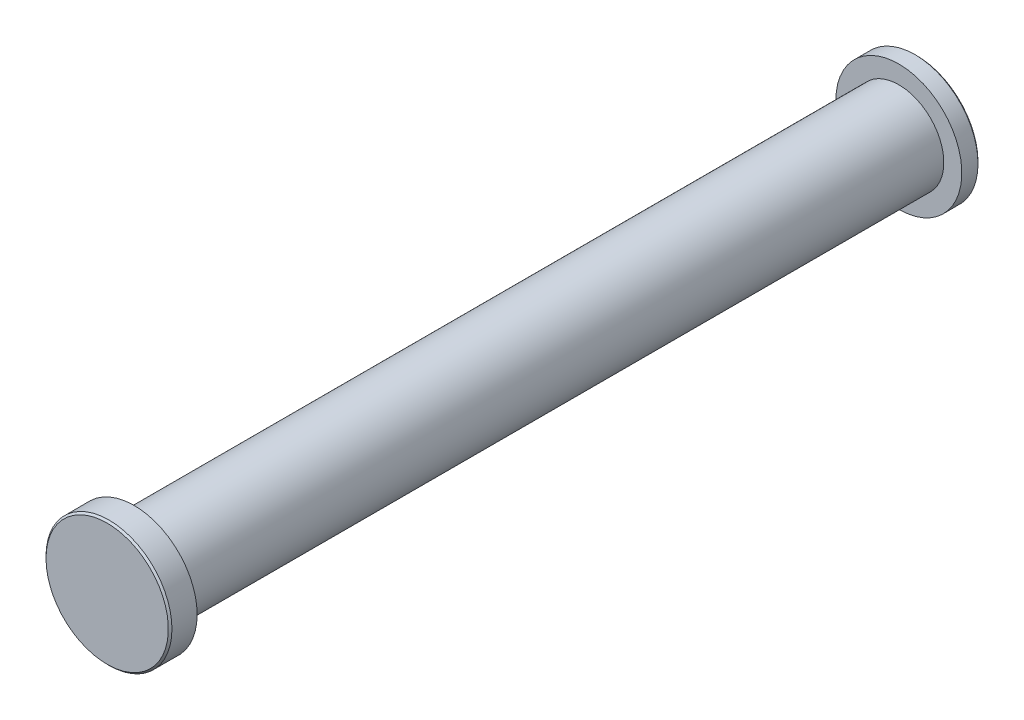
ISO-10303-21;
HEADER;
FILE_DESCRIPTION(('STEP AP214'),'2;1');
FILE_NAME('part.step','',(''),(''),'','','');
FILE_SCHEMA(('AUTOMOTIVE_DESIGN { 1 0 10303 214 1 1 1 1 }'));
ENDSEC;
DATA;
#1=APPLICATION_CONTEXT('core data for automotive mechanical design processes');
#2=APPLICATION_PROTOCOL_DEFINITION('international standard','automotive_design',2000,#1);
#3=PRODUCT_CONTEXT('',#1,'mechanical');
#4=PRODUCT('Part','Part','',(#3));
#5=PRODUCT_RELATED_PRODUCT_CATEGORY('part','',(#4));
#6=PRODUCT_DEFINITION_FORMATION('','',#4);
#7=PRODUCT_DEFINITION_CONTEXT('part definition',#1,'design');
#8=PRODUCT_DEFINITION('design','',#6,#7);
#9=PRODUCT_DEFINITION_SHAPE('','',#8);
#10=(LENGTH_UNIT() NAMED_UNIT(*) SI_UNIT(.MILLI.,.METRE.));
#11=(NAMED_UNIT(*) PLANE_ANGLE_UNIT() SI_UNIT($,.RADIAN.));
#12=(NAMED_UNIT(*) SI_UNIT($,.STERADIAN.) SOLID_ANGLE_UNIT());
#13=UNCERTAINTY_MEASURE_WITH_UNIT(LENGTH_MEASURE(1.E-05),#10,'distance_accuracy_value','');
#14=(GEOMETRIC_REPRESENTATION_CONTEXT(3) GLOBAL_UNCERTAINTY_ASSIGNED_CONTEXT((#13)) GLOBAL_UNIT_ASSIGNED_CONTEXT((#10,
#11,#12)) REPRESENTATION_CONTEXT('',''));
#15=CARTESIAN_POINT('',(0.,0.,0.));
#16=DIRECTION('',(0.,0.,1.));
#17=DIRECTION('',(1.,0.,0.));
#18=AXIS2_PLACEMENT_3D('',#15,#16,#17);
#19=CARTESIAN_POINT('',(-6.8816,-6.8816,0.));
#20=DIRECTION('',(0.,0.,1.));
#21=DIRECTION('',(1.,0.,0.));
#22=AXIS2_PLACEMENT_3D('',#19,#20,#21);
#23=PLANE('',#22);
#24=CARTESIAN_POINT('',(0.,0.,0.));
#25=DIRECTION('',(0.,0.,1.));
#26=DIRECTION('',(1.,0.,0.));
#27=AXIS2_PLACEMENT_3D('',#24,#25,#26);
#28=CIRCLE('',#27,6.8);
#29=CARTESIAN_POINT('',(6.8,0.,0.));
#30=VERTEX_POINT('',#29);
#31=EDGE_CURVE('E18',#30,#30,#28,.F.);
#32=ORIENTED_EDGE('',*,*,#31,.T.);
#33=EDGE_LOOP('',(#32));
#34=FACE_BOUND('',#33,.T.);
#35=ADVANCED_FACE('F14',(#34),#23,.F.);
#36=CARTESIAN_POINT('',(0.,0.,0.));
#37=DIRECTION('',(0.,0.,1.));
#38=DIRECTION('',(1.,0.,0.));
#39=AXIS2_PLACEMENT_3D('',#36,#37,#38);
#40=CONICAL_SURFACE('',#39,6.8,0.78539816339745);
#41=CARTESIAN_POINT('',(0.,0.,0.2));
#42=DIRECTION('',(0.,0.,-1.));
#43=DIRECTION('',(-1.,0.,0.));
#44=AXIS2_PLACEMENT_3D('',#41,#42,#43);
#45=CIRCLE('',#44,7.);
#46=CARTESIAN_POINT('',(-7.,0.,0.2));
#47=VERTEX_POINT('',#46);
#48=EDGE_CURVE('E31',#47,#47,#45,.T.);
#49=ORIENTED_EDGE('',*,*,#48,.T.);
#50=EDGE_LOOP('',(#49));
#51=FACE_BOUND('',#50,.T.);
#52=ORIENTED_EDGE('',*,*,#31,.F.);
#53=EDGE_LOOP('',(#52));
#54=FACE_BOUND('',#53,.T.);
#55=ADVANCED_FACE('F50',(#51,#54),#40,.T.);
#56=CARTESIAN_POINT('',(0.,0.,2.));
#57=DIRECTION('',(0.,0.,-1.));
#58=DIRECTION('',(-1.,0.,0.));
#59=AXIS2_PLACEMENT_3D('',#56,#57,#58);
#60=CYLINDRICAL_SURFACE('',#59,7.);
#61=ORIENTED_EDGE('',*,*,#48,.F.);
#62=EDGE_LOOP('',(#61));
#63=FACE_BOUND('',#62,.T.);
#64=CARTESIAN_POINT('',(0.,0.,2.));
#65=DIRECTION('',(0.,0.,-1.));
#66=DIRECTION('',(-1.,0.,0.));
#67=AXIS2_PLACEMENT_3D('',#64,#65,#66);
#68=CIRCLE('',#67,7.);
#69=CARTESIAN_POINT('',(-7.,0.,2.));
#70=VERTEX_POINT('',#69);
#71=EDGE_CURVE('E39',#70,#70,#68,.T.);
#72=ORIENTED_EDGE('',*,*,#71,.T.);
#73=EDGE_LOOP('',(#72));
#74=FACE_BOUND('',#73,.T.);
#75=ADVANCED_FACE('F52',(#63,#74),#60,.T.);
#76=CARTESIAN_POINT('',(7.084,-7.084,2.));
#77=DIRECTION('',(0.,0.,-1.));
#78=DIRECTION('',(-1.,0.,0.));
#79=AXIS2_PLACEMENT_3D('',#76,#77,#78);
#80=PLANE('',#79);
#81=CARTESIAN_POINT('',(0.,0.,2.));
#82=DIRECTION('',(0.,0.,-1.));
#83=DIRECTION('',(-1.,0.,0.));
#84=AXIS2_PLACEMENT_3D('',#81,#82,#83);
#85=CIRCLE('',#84,5.);
#86=CARTESIAN_POINT('',(-5.,0.,2.));
#87=VERTEX_POINT('',#86);
#88=EDGE_CURVE('E37',#87,#87,#85,.T.);
#89=ORIENTED_EDGE('',*,*,#88,.T.);
#90=EDGE_LOOP('',(#89));
#91=FACE_BOUND('',#90,.T.);
#92=ORIENTED_EDGE('',*,*,#71,.F.);
#93=EDGE_LOOP('',(#92));
#94=FACE_BOUND('',#93,.T.);
#95=ADVANCED_FACE('F59',(#91,#94),#80,.F.);
#96=CARTESIAN_POINT('',(0.,0.,87.));
#97=DIRECTION('',(0.,0.,-1.));
#98=DIRECTION('',(-1.,0.,0.));
#99=AXIS2_PLACEMENT_3D('',#96,#97,#98);
#100=CYLINDRICAL_SURFACE('',#99,5.);
#101=CARTESIAN_POINT('',(0.,0.,87.));
#102=DIRECTION('',(0.,0.,-1.));
#103=DIRECTION('',(-1.,0.,0.));
#104=AXIS2_PLACEMENT_3D('',#101,#102,#103);
#105=CIRCLE('',#104,5.);
#106=CARTESIAN_POINT('',(-5.,0.,87.));
#107=VERTEX_POINT('',#106);
#108=EDGE_CURVE('E34',#107,#107,#105,.T.);
#109=ORIENTED_EDGE('',*,*,#108,.T.);
#110=EDGE_LOOP('',(#109));
#111=FACE_BOUND('',#110,.T.);
#112=ORIENTED_EDGE('',*,*,#88,.F.);
#113=EDGE_LOOP('',(#112));
#114=FACE_BOUND('',#113,.T.);
#115=ADVANCED_FACE('F77',(#111,#114),#100,.T.);
#116=CARTESIAN_POINT('',(-7.084,-7.084,87.));
#117=DIRECTION('',(0.,0.,1.));
#118=DIRECTION('',(1.,0.,0.));
#119=AXIS2_PLACEMENT_3D('',#116,#117,#118);
#120=PLANE('',#119);
#121=ORIENTED_EDGE('',*,*,#108,.F.);
#122=EDGE_LOOP('',(#121));
#123=FACE_BOUND('',#122,.T.);
#124=CARTESIAN_POINT('',(0.,0.,87.));
#125=DIRECTION('',(0.,0.,1.));
#126=DIRECTION('',(1.,0.,0.));
#127=AXIS2_PLACEMENT_3D('',#124,#125,#126);
#128=CIRCLE('',#127,7.);
#129=CARTESIAN_POINT('',(7.,0.,87.));
#130=VERTEX_POINT('',#129);
#131=EDGE_CURVE('E27',#130,#130,#128,.F.);
#132=ORIENTED_EDGE('',*,*,#131,.T.);
#133=EDGE_LOOP('',(#132));
#134=FACE_BOUND('',#133,.T.);
#135=ADVANCED_FACE('F75',(#123,#134),#120,.F.);
#136=CARTESIAN_POINT('',(0.,0.,87.));
#137=DIRECTION('',(0.,0.,1.));
#138=DIRECTION('',(1.,0.,0.));
#139=AXIS2_PLACEMENT_3D('',#136,#137,#138);
#140=CYLINDRICAL_SURFACE('',#139,7.);
#141=CARTESIAN_POINT('',(0.,0.,89.8000000000001));
#142=DIRECTION('',(0.,0.,-1.));
#143=DIRECTION('',(-1.,0.,0.));
#144=AXIS2_PLACEMENT_3D('',#141,#142,#143);
#145=CIRCLE('',#144,7.);
#146=CARTESIAN_POINT('',(-7.,0.,89.8));
#147=VERTEX_POINT('',#146);
#148=EDGE_CURVE('E22',#147,#147,#145,.T.);
#149=ORIENTED_EDGE('',*,*,#148,.T.);
#150=EDGE_LOOP('',(#149));
#151=FACE_BOUND('',#150,.T.);
#152=ORIENTED_EDGE('',*,*,#131,.F.);
#153=EDGE_LOOP('',(#152));
#154=FACE_BOUND('',#153,.T.);
#155=ADVANCED_FACE('F70',(#151,#154),#140,.T.);
#156=CARTESIAN_POINT('',(-6.8816,-6.8816,90.));
#157=DIRECTION('',(0.,0.,1.));
#158=DIRECTION('',(1.,0.,0.));
#159=AXIS2_PLACEMENT_3D('',#156,#157,#158);
#160=PLANE('',#159);
#161=CARTESIAN_POINT('',(0.,0.,90.0000000000001));
#162=DIRECTION('',(0.,0.,-1.));
#163=DIRECTION('',(-1.,0.,0.));
#164=AXIS2_PLACEMENT_3D('',#161,#162,#163);
#165=CIRCLE('',#164,6.79999999999992);
#166=CARTESIAN_POINT('',(-6.79999999999992,0.,90.0000000000001));
#167=VERTEX_POINT('',#166);
#168=EDGE_CURVE('E10',#167,#167,#165,.F.);
#169=ORIENTED_EDGE('',*,*,#168,.T.);
#170=EDGE_LOOP('',(#169));
#171=FACE_BOUND('',#170,.T.);
#172=ADVANCED_FACE('F16',(#171),#160,.T.);
#173=CARTESIAN_POINT('',(0.,0.,90.));
#174=DIRECTION('',(0.,0.,-1.));
#175=DIRECTION('',(-1.,0.,0.));
#176=AXIS2_PLACEMENT_3D('',#173,#174,#175);
#177=CONICAL_SURFACE('',#176,6.8,0.78539816339747);
#178=ORIENTED_EDGE('',*,*,#168,.F.);
#179=EDGE_LOOP('',(#178));
#180=FACE_BOUND('',#179,.T.);
#181=ORIENTED_EDGE('',*,*,#148,.F.);
#182=EDGE_LOOP('',(#181));
#183=FACE_BOUND('',#182,.T.);
#184=ADVANCED_FACE('F63',(#180,#183),#177,.T.);
#185=CLOSED_SHELL('',(#35,#55,#75,#95,#115,#135,#155,#172,#184));
#186=MANIFOLD_SOLID_BREP('B1',#185);
#187=ADVANCED_BREP_SHAPE_REPRESENTATION('',(#18,#186),#14);
#188=SHAPE_DEFINITION_REPRESENTATION(#9,#187);
ENDSEC;
END-ISO-10303-21;
